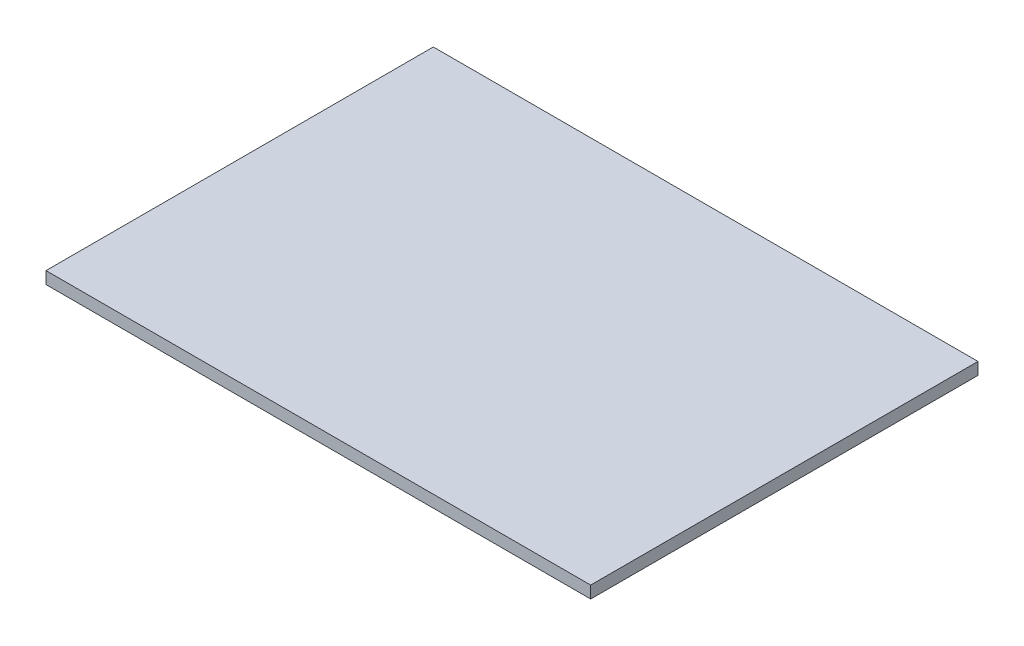
ISO-10303-21;
HEADER;
FILE_DESCRIPTION(('STEP AP214'),'2;1');
FILE_NAME('part.step','',(''),(''),'','','');
FILE_SCHEMA(('AUTOMOTIVE_DESIGN { 1 0 10303 214 1 1 1 1 }'));
ENDSEC;
DATA;
#1=APPLICATION_CONTEXT('core data for automotive mechanical design processes');
#2=APPLICATION_PROTOCOL_DEFINITION('international standard','automotive_design',2000,#1);
#3=PRODUCT_CONTEXT('',#1,'mechanical');
#4=PRODUCT('Part','Part','',(#3));
#5=PRODUCT_RELATED_PRODUCT_CATEGORY('part','',(#4));
#6=PRODUCT_DEFINITION_FORMATION('','',#4);
#7=PRODUCT_DEFINITION_CONTEXT('part definition',#1,'design');
#8=PRODUCT_DEFINITION('design','',#6,#7);
#9=PRODUCT_DEFINITION_SHAPE('','',#8);
#10=(LENGTH_UNIT() NAMED_UNIT(*) SI_UNIT(.MILLI.,.METRE.));
#11=(NAMED_UNIT(*) PLANE_ANGLE_UNIT() SI_UNIT($,.RADIAN.));
#12=(NAMED_UNIT(*) SI_UNIT($,.STERADIAN.) SOLID_ANGLE_UNIT());
#13=UNCERTAINTY_MEASURE_WITH_UNIT(LENGTH_MEASURE(1.E-05),#10,'distance_accuracy_value','');
#14=(GEOMETRIC_REPRESENTATION_CONTEXT(3) GLOBAL_UNCERTAINTY_ASSIGNED_CONTEXT((#13)) GLOBAL_UNIT_ASSIGNED_CONTEXT((#10,
#11,#12)) REPRESENTATION_CONTEXT('',''));
#15=CARTESIAN_POINT('',(0.,0.,0.));
#16=DIRECTION('',(0.,0.,1.));
#17=DIRECTION('',(1.,0.,0.));
#18=AXIS2_PLACEMENT_3D('',#15,#16,#17);
#19=CARTESIAN_POINT('',(0.,1.,0.));
#20=DIRECTION('',(1.,0.,0.));
#21=DIRECTION('',(0.,0.,-1.));
#22=AXIS2_PLACEMENT_3D('',#19,#20,#21);
#23=PLANE('',#22);
#24=DIRECTION('',(0.,0.,1.));
#25=VECTOR('',#24,1.);
#26=CARTESIAN_POINT('',(0.,0.,0.));
#27=LINE('',#26,#25);
#28=CARTESIAN_POINT('',(0.,0.,-32.));
#29=VERTEX_POINT('',#28);
#30=CARTESIAN_POINT('',(0.,0.,0.));
#31=VERTEX_POINT('',#30);
#32=EDGE_CURVE('E97',#29,#31,#27,.T.);
#33=ORIENTED_EDGE('',*,*,#32,.T.);
#34=DIRECTION('',(0.,-1.,0.));
#35=VECTOR('',#34,1.);
#36=CARTESIAN_POINT('',(0.,1.,0.));
#37=LINE('',#36,#35);
#38=CARTESIAN_POINT('',(0.,1.,0.));
#39=VERTEX_POINT('',#38);
#40=EDGE_CURVE('E11',#39,#31,#37,.T.);
#41=ORIENTED_EDGE('',*,*,#40,.F.);
#42=DIRECTION('',(0.,0.,1.));
#43=VECTOR('',#42,1.);
#44=CARTESIAN_POINT('',(0.,1.,0.));
#45=LINE('',#44,#43);
#46=CARTESIAN_POINT('',(0.,1.,-32.));
#47=VERTEX_POINT('',#46);
#48=EDGE_CURVE('E85',#47,#39,#45,.T.);
#49=ORIENTED_EDGE('',*,*,#48,.F.);
#50=DIRECTION('',(0.,-1.,0.));
#51=VECTOR('',#50,1.);
#52=CARTESIAN_POINT('',(0.,1.,-32.));
#53=LINE('',#52,#51);
#54=EDGE_CURVE('E93',#47,#29,#53,.T.);
#55=ORIENTED_EDGE('',*,*,#54,.T.);
#56=EDGE_LOOP('',(#33,#41,#49,#55));
#57=FACE_BOUND('',#56,.T.);
#58=ADVANCED_FACE('F34',(#57),#23,.F.);
#59=CARTESIAN_POINT('',(0.,1.,0.));
#60=DIRECTION('',(0.,0.,-1.));
#61=DIRECTION('',(-1.,0.,0.));
#62=AXIS2_PLACEMENT_3D('',#59,#60,#61);
#63=PLANE('',#62);
#64=DIRECTION('',(1.,0.,0.));
#65=VECTOR('',#64,1.);
#66=CARTESIAN_POINT('',(0.,0.,0.));
#67=LINE('',#66,#65);
#68=CARTESIAN_POINT('',(45.,0.,0.));
#69=VERTEX_POINT('',#68);
#70=EDGE_CURVE('E89',#31,#69,#67,.T.);
#71=ORIENTED_EDGE('',*,*,#70,.T.);
#72=DIRECTION('',(0.,-1.,0.));
#73=VECTOR('',#72,1.);
#74=CARTESIAN_POINT('',(45.,1.,0.));
#75=LINE('',#74,#73);
#76=CARTESIAN_POINT('',(45.,1.,0.));
#77=VERTEX_POINT('',#76);
#78=EDGE_CURVE('E42',#77,#69,#75,.T.);
#79=ORIENTED_EDGE('',*,*,#78,.F.);
#80=DIRECTION('',(1.,0.,0.));
#81=VECTOR('',#80,1.);
#82=CARTESIAN_POINT('',(0.,1.,0.));
#83=LINE('',#82,#81);
#84=EDGE_CURVE('E80',#39,#77,#83,.T.);
#85=ORIENTED_EDGE('',*,*,#84,.F.);
#86=ORIENTED_EDGE('',*,*,#40,.T.);
#87=EDGE_LOOP('',(#71,#79,#85,#86));
#88=FACE_BOUND('',#87,.T.);
#89=ADVANCED_FACE('F88',(#88),#63,.F.);
#90=CARTESIAN_POINT('',(45.,1.,0.));
#91=DIRECTION('',(-1.,0.,0.));
#92=DIRECTION('',(0.,0.,1.));
#93=AXIS2_PLACEMENT_3D('',#90,#91,#92);
#94=PLANE('',#93);
#95=DIRECTION('',(0.,0.,-1.));
#96=VECTOR('',#95,1.);
#97=CARTESIAN_POINT('',(45.,0.,0.));
#98=LINE('',#97,#96);
#99=CARTESIAN_POINT('',(45.,0.,-32.));
#100=VERTEX_POINT('',#99);
#101=EDGE_CURVE('E67',#69,#100,#98,.T.);
#102=ORIENTED_EDGE('',*,*,#101,.T.);
#103=DIRECTION('',(0.,-1.,0.));
#104=VECTOR('',#103,1.);
#105=CARTESIAN_POINT('',(45.,1.,-32.));
#106=LINE('',#105,#104);
#107=CARTESIAN_POINT('',(45.,1.,-32.));
#108=VERTEX_POINT('',#107);
#109=EDGE_CURVE('E90',#108,#100,#106,.T.);
#110=ORIENTED_EDGE('',*,*,#109,.F.);
#111=DIRECTION('',(0.,0.,-1.));
#112=VECTOR('',#111,1.);
#113=CARTESIAN_POINT('',(45.,1.,0.));
#114=LINE('',#113,#112);
#115=EDGE_CURVE('E83',#77,#108,#114,.T.);
#116=ORIENTED_EDGE('',*,*,#115,.F.);
#117=ORIENTED_EDGE('',*,*,#78,.T.);
#118=EDGE_LOOP('',(#102,#110,#116,#117));
#119=FACE_BOUND('',#118,.T.);
#120=ADVANCED_FACE('F91',(#119),#94,.F.);
#121=CARTESIAN_POINT('',(0.,1.,-32.));
#122=DIRECTION('',(0.,0.,1.));
#123=DIRECTION('',(1.,0.,0.));
#124=AXIS2_PLACEMENT_3D('',#121,#122,#123);
#125=PLANE('',#124);
#126=DIRECTION('',(-1.,0.,0.));
#127=VECTOR('',#126,1.);
#128=CARTESIAN_POINT('',(0.,0.,-32.));
#129=LINE('',#128,#127);
#130=EDGE_CURVE('E73',#100,#29,#129,.T.);
#131=ORIENTED_EDGE('',*,*,#130,.T.);
#132=ORIENTED_EDGE('',*,*,#54,.F.);
#133=DIRECTION('',(-1.,0.,0.));
#134=VECTOR('',#133,1.);
#135=CARTESIAN_POINT('',(0.,1.,-32.));
#136=LINE('',#135,#134);
#137=EDGE_CURVE('E50',#108,#47,#136,.T.);
#138=ORIENTED_EDGE('',*,*,#137,.F.);
#139=ORIENTED_EDGE('',*,*,#109,.T.);
#140=EDGE_LOOP('',(#131,#132,#138,#139));
#141=FACE_BOUND('',#140,.T.);
#142=ADVANCED_FACE('F104',(#141),#125,.F.);
#143=CARTESIAN_POINT('',(0.,1.,0.));
#144=DIRECTION('',(0.,-1.,0.));
#145=DIRECTION('',(0.,0.,-1.));
#146=AXIS2_PLACEMENT_3D('',#143,#144,#145);
#147=PLANE('',#146);
#148=ORIENTED_EDGE('',*,*,#48,.T.);
#149=ORIENTED_EDGE('',*,*,#84,.T.);
#150=ORIENTED_EDGE('',*,*,#115,.T.);
#151=ORIENTED_EDGE('',*,*,#137,.T.);
#152=EDGE_LOOP('',(#148,#149,#150,#151));
#153=FACE_BOUND('',#152,.T.);
#154=ADVANCED_FACE('F81',(#153),#147,.F.);
#155=CARTESIAN_POINT('',(0.,0.,0.));
#156=DIRECTION('',(0.,-1.,0.));
#157=DIRECTION('',(0.,0.,-1.));
#158=AXIS2_PLACEMENT_3D('',#155,#156,#157);
#159=PLANE('',#158);
#160=ORIENTED_EDGE('',*,*,#32,.F.);
#161=ORIENTED_EDGE('',*,*,#130,.F.);
#162=ORIENTED_EDGE('',*,*,#101,.F.);
#163=ORIENTED_EDGE('',*,*,#70,.F.);
#164=EDGE_LOOP('',(#160,#161,#162,#163));
#165=FACE_BOUND('',#164,.T.);
#166=ADVANCED_FACE('F107',(#165),#159,.T.);
#167=CLOSED_SHELL('',(#58,#89,#120,#142,#154,#166));
#168=MANIFOLD_SOLID_BREP('B2',#167);
#169=ADVANCED_BREP_SHAPE_REPRESENTATION('',(#18,#168),#14);
#170=SHAPE_DEFINITION_REPRESENTATION(#9,#169);
ENDSEC;
END-ISO-10303-21;
